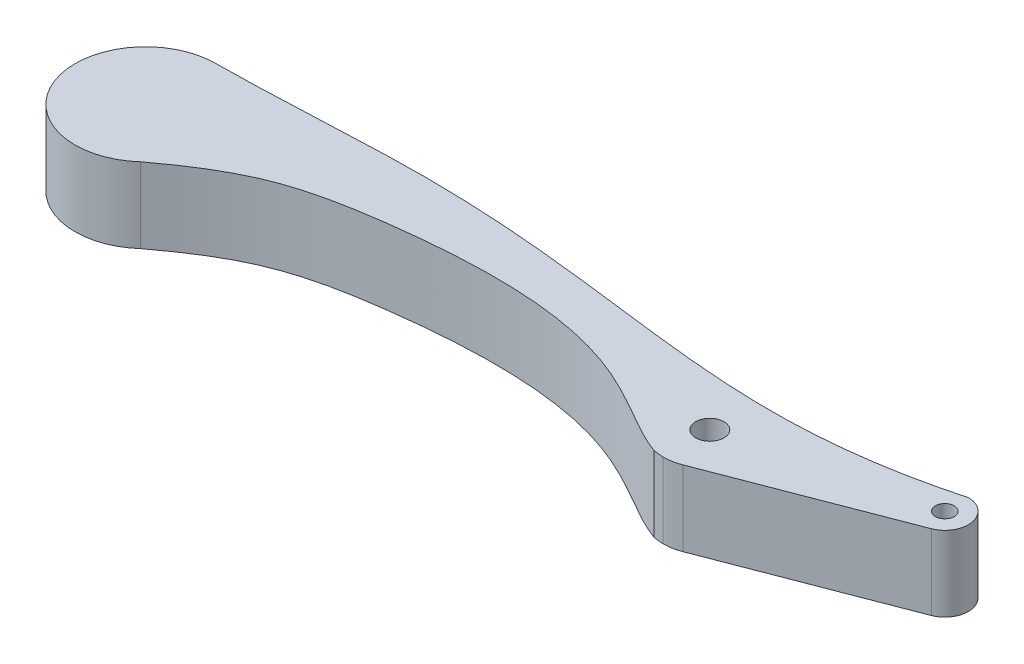
ISO-10303-21;
HEADER;
FILE_DESCRIPTION(('STEP AP214'),'2;1');
FILE_NAME('part.step','',(''),(''),'','','');
FILE_SCHEMA(('AUTOMOTIVE_DESIGN { 1 0 10303 214 1 1 1 1 }'));
ENDSEC;
DATA;
#1=APPLICATION_CONTEXT('core data for automotive mechanical design processes');
#2=APPLICATION_PROTOCOL_DEFINITION('international standard','automotive_design',2000,#1);
#3=PRODUCT_CONTEXT('',#1,'mechanical');
#4=PRODUCT('Part','Part','',(#3));
#5=PRODUCT_RELATED_PRODUCT_CATEGORY('part','',(#4));
#6=PRODUCT_DEFINITION_FORMATION('','',#4);
#7=PRODUCT_DEFINITION_CONTEXT('part definition',#1,'design');
#8=PRODUCT_DEFINITION('design','',#6,#7);
#9=PRODUCT_DEFINITION_SHAPE('','',#8);
#10=(LENGTH_UNIT() NAMED_UNIT(*) SI_UNIT(.MILLI.,.METRE.));
#11=(NAMED_UNIT(*) PLANE_ANGLE_UNIT() SI_UNIT($,.RADIAN.));
#12=(NAMED_UNIT(*) SI_UNIT($,.STERADIAN.) SOLID_ANGLE_UNIT());
#13=UNCERTAINTY_MEASURE_WITH_UNIT(LENGTH_MEASURE(1.E-05),#10,'distance_accuracy_value','');
#14=(GEOMETRIC_REPRESENTATION_CONTEXT(3) GLOBAL_UNCERTAINTY_ASSIGNED_CONTEXT((#13)) GLOBAL_UNIT_ASSIGNED_CONTEXT((#10,
#11,#12)) REPRESENTATION_CONTEXT('',''));
#15=CARTESIAN_POINT('',(0.,0.,0.));
#16=DIRECTION('',(0.,0.,1.));
#17=DIRECTION('',(1.,0.,0.));
#18=AXIS2_PLACEMENT_3D('',#15,#16,#17);
#19=CARTESIAN_POINT('',(0.,8.,-7.5));
#20=CARTESIAN_POINT('',(6.59618739379903,8.,-7.53042618499185));
#21=CARTESIAN_POINT('',(41.0181532042921,8.,-10.2662820268828));
#22=CARTESIAN_POINT('',(57.4957136227641,8.,-1.43169155879023));
#23=CARTESIAN_POINT('',(79.9999926350941,8.,-7.52972858327825));
#24=B_SPLINE_CURVE_WITH_KNOTS('',3,(#19,#20,#21,#22,#23),.UNSPECIFIED.,.F.,.F.,(4,1,4),(0.,
0.213970645101802,1.),.UNSPECIFIED.);
#25=DIRECTION('',(0.,-1.,0.));
#26=VECTOR('',#25,1.);
#27=SURFACE_OF_LINEAR_EXTRUSION('',#24,#26);
#28=CARTESIAN_POINT('',(0.,0.,-7.5));
#29=CARTESIAN_POINT('',(6.59618739379903,0.,-7.53042618499185));
#30=CARTESIAN_POINT('',(41.0181532042921,0.,-10.2662820268828));
#31=CARTESIAN_POINT('',(57.4957136227641,0.,-1.43169155879023));
#32=CARTESIAN_POINT('',(79.9999926350941,0.,-7.52972858327825));
#33=B_SPLINE_CURVE_WITH_KNOTS('',3,(#28,#29,#30,#31,#32),.UNSPECIFIED.,.F.,.F.,(4,1,4),(0.,
0.213970645101802,1.),.UNSPECIFIED.);
#34=CARTESIAN_POINT('',(0.,0.,-7.49999999999999));
#35=VERTEX_POINT('',#34);
#36=CARTESIAN_POINT('',(79.999992635094,0.,-7.52972858327824));
#37=VERTEX_POINT('',#36);
#38=EDGE_CURVE('E145',#35,#37,#33,.T.);
#39=ORIENTED_EDGE('',*,*,#38,.F.);
#40=DIRECTION('',(0.,-1.,0.));
#41=VECTOR('',#40,1.);
#42=CARTESIAN_POINT('',(0.,8.,-7.49999999999999));
#43=LINE('',#42,#41);
#44=CARTESIAN_POINT('',(0.,8.,-7.49999999999999));
#45=VERTEX_POINT('',#44);
#46=EDGE_CURVE('E11',#45,#35,#43,.T.);
#47=ORIENTED_EDGE('',*,*,#46,.F.);
#48=CARTESIAN_POINT('',(79.999992635094,8.,-7.52972858327824));
#49=VERTEX_POINT('',#48);
#50=EDGE_CURVE('E186',#45,#49,#24,.T.);
#51=ORIENTED_EDGE('',*,*,#50,.T.);
#52=DIRECTION('',(0.,-1.,0.));
#53=VECTOR('',#52,1.);
#54=CARTESIAN_POINT('',(79.999992635094,8.,-7.52972858327824));
#55=LINE('',#54,#53);
#56=EDGE_CURVE('E94',#49,#37,#55,.T.);
#57=ORIENTED_EDGE('',*,*,#56,.T.);
#58=EDGE_LOOP('',(#39,#47,#51,#57));
#59=FACE_BOUND('',#58,.T.);
#60=ADVANCED_FACE('F45',(#59),#27,.T.);
#61=CARTESIAN_POINT('',(5.03731244492082,8.,5.55657118484465));
#62=CARTESIAN_POINT('',(8.0215715054593,8.,3.32285112044769));
#63=CARTESIAN_POINT('',(13.6358152084039,8.,-0.236701705320971));
#64=CARTESIAN_POINT('',(47.1128364124341,8.,-6.0862178555139));
#65=CARTESIAN_POINT('',(52.1283803955074,8.,2.37645542334605));
#66=CARTESIAN_POINT('',(58.9707228196847,8.,4.86318503205236));
#67=B_SPLINE_CURVE_WITH_KNOTS('',3,(#61,#62,#63,#64,#65,#66),.UNSPECIFIED.,.F.,.F.,(4,1,1,4),
(0.0206670520231245,0.119805518021766,0.217738812819453,1.),.UNSPECIFIED.);
#68=DIRECTION('',(0.,-1.,0.));
#69=VECTOR('',#68,1.);
#70=SURFACE_OF_LINEAR_EXTRUSION('',#67,#69);
#71=CARTESIAN_POINT('',(5.03731244492082,0.,5.55657118484465));
#72=CARTESIAN_POINT('',(8.0215715054593,0.,3.32285112044769));
#73=CARTESIAN_POINT('',(13.6358152084039,0.,-0.236701705320971));
#74=CARTESIAN_POINT('',(47.1128364124341,0.,-6.0862178555139));
#75=CARTESIAN_POINT('',(52.1283803955074,0.,2.37645542334605));
#76=CARTESIAN_POINT('',(58.9707228196847,0.,4.86318503205236));
#77=B_SPLINE_CURVE_WITH_KNOTS('',3,(#71,#72,#73,#74,#75,#76),.UNSPECIFIED.,.F.,.F.,(4,1,1,4),
(0.0206670520231245,0.119805518021766,0.217738812819453,1.),.UNSPECIFIED.);
#78=CARTESIAN_POINT('',(5.03731244492081,0.,5.55657118484464));
#79=VERTEX_POINT('',#78);
#80=CARTESIAN_POINT('',(58.9707228196847,0.,4.86318503205234));
#81=VERTEX_POINT('',#80);
#82=EDGE_CURVE('E151',#79,#81,#77,.T.);
#83=ORIENTED_EDGE('',*,*,#82,.T.);
#84=DIRECTION('',(0.,-1.,0.));
#85=VECTOR('',#84,1.);
#86=CARTESIAN_POINT('',(58.9707228196847,8.,4.86318503205234));
#87=LINE('',#86,#85);
#88=CARTESIAN_POINT('',(58.9707228196847,8.,4.86318503205234));
#89=VERTEX_POINT('',#88);
#90=EDGE_CURVE('E193',#89,#81,#87,.T.);
#91=ORIENTED_EDGE('',*,*,#90,.F.);
#92=CARTESIAN_POINT('',(5.03731244492081,8.,5.55657118484464));
#93=VERTEX_POINT('',#92);
#94=EDGE_CURVE('E102',#93,#89,#67,.T.);
#95=ORIENTED_EDGE('',*,*,#94,.F.);
#96=DIRECTION('',(0.,-1.,0.));
#97=VECTOR('',#96,1.);
#98=CARTESIAN_POINT('',(5.03731244492081,8.,5.55657118484464));
#99=LINE('',#98,#97);
#100=EDGE_CURVE('E55',#93,#79,#99,.T.);
#101=ORIENTED_EDGE('',*,*,#100,.T.);
#102=EDGE_LOOP('',(#83,#91,#95,#101));
#103=FACE_BOUND('',#102,.T.);
#104=ADVANCED_FACE('F201',(#103),#70,.F.);
#105=CARTESIAN_POINT('',(58.9707228196847,8.,4.86318503205232));
#106=CARTESIAN_POINT('',(58.9781403232572,8.,4.86320370724343));
#107=CARTESIAN_POINT('',(59.992575824296,8.,4.97025708409772));
#108=CARTESIAN_POINT('',(59.999992635094,8.,4.97027141672176));
#109=B_SPLINE_CURVE_WITH_KNOTS('',3,(#105,#106,#107,#108),.UNSPECIFIED.,.F.,.F.,(4,4),
(0.714198539813145,0.714487623139183),.UNSPECIFIED.);
#110=DIRECTION('',(0.,-1.,0.));
#111=VECTOR('',#110,1.);
#112=SURFACE_OF_LINEAR_EXTRUSION('',#109,#111);
#113=CARTESIAN_POINT('',(58.9707228196847,0.,4.86318503205232));
#114=CARTESIAN_POINT('',(58.9781403232572,0.,4.86320370724343));
#115=CARTESIAN_POINT('',(59.992575824296,0.,4.97025708409772));
#116=CARTESIAN_POINT('',(59.999992635094,0.,4.97027141672176));
#117=B_SPLINE_CURVE_WITH_KNOTS('',3,(#113,#114,#115,#116),.UNSPECIFIED.,.F.,.F.,(4,4),
(0.714198539813145,0.714487623139183),.UNSPECIFIED.);
#118=CARTESIAN_POINT('',(59.999992635094,0.,4.97027141672176));
#119=VERTEX_POINT('',#118);
#120=EDGE_CURVE('E160',#81,#119,#117,.T.);
#121=ORIENTED_EDGE('',*,*,#120,.T.);
#122=DIRECTION('',(0.,-1.,0.));
#123=VECTOR('',#122,1.);
#124=CARTESIAN_POINT('',(59.999992635094,8.,4.97027141672176));
#125=LINE('',#124,#123);
#126=CARTESIAN_POINT('',(59.999992635094,8.,4.97027141672176));
#127=VERTEX_POINT('',#126);
#128=EDGE_CURVE('E127',#127,#119,#125,.T.);
#129=ORIENTED_EDGE('',*,*,#128,.F.);
#130=EDGE_CURVE('E116',#89,#127,#109,.T.);
#131=ORIENTED_EDGE('',*,*,#130,.F.);
#132=ORIENTED_EDGE('',*,*,#90,.T.);
#133=EDGE_LOOP('',(#121,#129,#131,#132));
#134=FACE_BOUND('',#133,.T.);
#135=ADVANCED_FACE('F213',(#134),#112,.F.);
#136=CARTESIAN_POINT('',(59.999992635094,8.,-0.0297285832782379));
#137=DIRECTION('',(0.,-1.,0.));
#138=DIRECTION('',(0.,0.,-1.));
#139=AXIS2_PLACEMENT_3D('',#136,#137,#138);
#140=CYLINDRICAL_SURFACE('',#139,5.);
#141=CARTESIAN_POINT('',(59.999992635094,0.,-0.0297285832782379));
#142=DIRECTION('',(0.,1.,0.));
#143=DIRECTION('',(0.,0.,1.));
#144=AXIS2_PLACEMENT_3D('',#141,#142,#143);
#145=CIRCLE('',#144,5.);
#146=CARTESIAN_POINT('',(61.7919562780164,0.,4.63812598841144));
#147=VERTEX_POINT('',#146);
#148=EDGE_CURVE('E125',#119,#147,#145,.T.);
#149=ORIENTED_EDGE('',*,*,#148,.T.);
#150=DIRECTION('',(0.,-1.,0.));
#151=VECTOR('',#150,1.);
#152=CARTESIAN_POINT('',(61.7919562780164,8.,4.63812598841144));
#153=LINE('',#152,#151);
#154=CARTESIAN_POINT('',(61.7919562780164,8.,4.63812598841144));
#155=VERTEX_POINT('',#154);
#156=EDGE_CURVE('E122',#155,#147,#153,.T.);
#157=ORIENTED_EDGE('',*,*,#156,.F.);
#158=CARTESIAN_POINT('',(59.999992635094,8.,-0.0297285832782379));
#159=DIRECTION('',(0.,1.,0.));
#160=DIRECTION('',(0.,0.,1.));
#161=AXIS2_PLACEMENT_3D('',#158,#159,#160);
#162=CIRCLE('',#161,5.);
#163=EDGE_CURVE('E109',#127,#155,#162,.T.);
#164=ORIENTED_EDGE('',*,*,#163,.F.);
#165=ORIENTED_EDGE('',*,*,#128,.T.);
#166=EDGE_LOOP('',(#149,#157,#164,#165));
#167=FACE_BOUND('',#166,.T.);
#168=ADVANCED_FACE('F123',(#167),#140,.T.);
#169=CARTESIAN_POINT('',(9.48873683222016,8.,24.717043661447));
#170=DIRECTION('',(-0.358392728584484,0.,-0.933570914337935));
#171=DIRECTION('',(-0.933570914337935,0.,0.358392728584484));
#172=AXIS2_PLACEMENT_3D('',#169,#170,#171);
#173=PLANE('',#172);
#174=DIRECTION('',(0.933570914337935,0.,-0.358392728584484));
#175=VECTOR('',#174,1.);
#176=CARTESIAN_POINT('',(9.48873683222016,0.,24.717043661447));
#177=LINE('',#176,#175);
#178=CARTESIAN_POINT('',(80.8959744565552,0.,-2.6958012974334));
#179=VERTEX_POINT('',#178);
#180=EDGE_CURVE('E87',#147,#179,#177,.T.);
#181=ORIENTED_EDGE('',*,*,#180,.T.);
#182=DIRECTION('',(0.,-1.,0.));
#183=VECTOR('',#182,1.);
#184=CARTESIAN_POINT('',(80.8959744565552,8.,-2.6958012974334));
#185=LINE('',#184,#183);
#186=CARTESIAN_POINT('',(80.8959744565552,8.,-2.6958012974334));
#187=VERTEX_POINT('',#186);
#188=EDGE_CURVE('E128',#187,#179,#185,.T.);
#189=ORIENTED_EDGE('',*,*,#188,.F.);
#190=DIRECTION('',(0.933570914337935,0.,-0.358392728584484));
#191=VECTOR('',#190,1.);
#192=CARTESIAN_POINT('',(9.48873683222016,8.,24.717043661447));
#193=LINE('',#192,#191);
#194=EDGE_CURVE('E114',#155,#187,#193,.T.);
#195=ORIENTED_EDGE('',*,*,#194,.F.);
#196=ORIENTED_EDGE('',*,*,#156,.T.);
#197=EDGE_LOOP('',(#181,#189,#195,#196));
#198=FACE_BOUND('',#197,.T.);
#199=ADVANCED_FACE('F130',(#198),#173,.F.);
#200=CARTESIAN_POINT('',(59.999992635094,8.,-0.0297285832782379));
#201=DIRECTION('',(0.,-1.,0.));
#202=DIRECTION('',(0.,0.,-1.));
#203=AXIS2_PLACEMENT_3D('',#200,#201,#202);
#204=CYLINDRICAL_SURFACE('',#203,1.5);
#205=CARTESIAN_POINT('',(59.999992635094,8.,-0.0297285832782379));
#206=DIRECTION('',(0.,1.,0.));
#207=DIRECTION('',(0.,0.,1.));
#208=AXIS2_PLACEMENT_3D('',#205,#206,#207);
#209=CIRCLE('',#208,1.5);
#210=CARTESIAN_POINT('',(59.999992635094,8.,1.47027141672176));
#211=VERTEX_POINT('',#210);
#212=EDGE_CURVE('E134',#211,#211,#209,.T.);
#213=ORIENTED_EDGE('',*,*,#212,.T.);
#214=EDGE_LOOP('',(#213));
#215=FACE_BOUND('',#214,.T.);
#216=CARTESIAN_POINT('',(59.999992635094,0.,-0.0297285832782379));
#217=DIRECTION('',(0.,1.,0.));
#218=DIRECTION('',(0.,0.,1.));
#219=AXIS2_PLACEMENT_3D('',#216,#217,#218);
#220=CIRCLE('',#219,1.5);
#221=CARTESIAN_POINT('',(59.999992635094,0.,1.47027141672176));
#222=VERTEX_POINT('',#221);
#223=EDGE_CURVE('E178',#222,#222,#220,.T.);
#224=ORIENTED_EDGE('',*,*,#223,.F.);
#225=EDGE_LOOP('',(#224));
#226=FACE_BOUND('',#225,.T.);
#227=ADVANCED_FACE('F266',(#215,#226),#204,.F.);
#228=CARTESIAN_POINT('',(79.999992635094,8.,-5.02972858327824));
#229=DIRECTION('',(0.,-1.,0.));
#230=DIRECTION('',(0.,0.,-1.));
#231=AXIS2_PLACEMENT_3D('',#228,#229,#230);
#232=CYLINDRICAL_SURFACE('',#231,2.50000000000001);
#233=CARTESIAN_POINT('',(79.999992635094,0.,-5.02972858327824));
#234=DIRECTION('',(0.,1.,0.));
#235=DIRECTION('',(0.,0.,1.));
#236=AXIS2_PLACEMENT_3D('',#233,#234,#235);
#237=CIRCLE('',#236,2.50000000000001);
#238=EDGE_CURVE('E175',#179,#37,#237,.T.);
#239=ORIENTED_EDGE('',*,*,#238,.T.);
#240=ORIENTED_EDGE('',*,*,#56,.F.);
#241=CARTESIAN_POINT('',(79.999992635094,8.,-5.02972858327824));
#242=DIRECTION('',(0.,1.,0.));
#243=DIRECTION('',(0.,0.,1.));
#244=AXIS2_PLACEMENT_3D('',#241,#242,#243);
#245=CIRCLE('',#244,2.50000000000001);
#246=EDGE_CURVE('E63',#187,#49,#245,.T.);
#247=ORIENTED_EDGE('',*,*,#246,.F.);
#248=ORIENTED_EDGE('',*,*,#188,.T.);
#249=EDGE_LOOP('',(#239,#240,#247,#248));
#250=FACE_BOUND('',#249,.T.);
#251=ADVANCED_FACE('F239',(#250),#232,.T.);
#252=CARTESIAN_POINT('',(79.999992635094,8.,-5.02972858327824));
#253=DIRECTION('',(0.,-1.,0.));
#254=DIRECTION('',(0.,0.,-1.));
#255=AXIS2_PLACEMENT_3D('',#252,#253,#254);
#256=CYLINDRICAL_SURFACE('',#255,0.999999999999998);
#257=CARTESIAN_POINT('',(79.999992635094,8.,-5.02972858327824));
#258=DIRECTION('',(0.,1.,0.));
#259=DIRECTION('',(0.,0.,1.));
#260=AXIS2_PLACEMENT_3D('',#257,#258,#259);
#261=CIRCLE('',#260,0.999999999999998);
#262=CARTESIAN_POINT('',(79.999992635094,8.,-4.02972858327824));
#263=VERTEX_POINT('',#262);
#264=EDGE_CURVE('E141',#263,#263,#261,.T.);
#265=ORIENTED_EDGE('',*,*,#264,.T.);
#266=EDGE_LOOP('',(#265));
#267=FACE_BOUND('',#266,.T.);
#268=CARTESIAN_POINT('',(79.999992635094,0.,-5.02972858327824));
#269=DIRECTION('',(0.,1.,0.));
#270=DIRECTION('',(0.,0.,1.));
#271=AXIS2_PLACEMENT_3D('',#268,#269,#270);
#272=CIRCLE('',#271,0.999999999999998);
#273=CARTESIAN_POINT('',(79.999992635094,0.,-4.02972858327824));
#274=VERTEX_POINT('',#273);
#275=EDGE_CURVE('E182',#274,#274,#272,.T.);
#276=ORIENTED_EDGE('',*,*,#275,.F.);
#277=EDGE_LOOP('',(#276));
#278=FACE_BOUND('',#277,.T.);
#279=ADVANCED_FACE('F261',(#267,#278),#256,.F.);
#280=CARTESIAN_POINT('',(0.,8.,0.));
#281=DIRECTION('',(0.,1.,0.));
#282=DIRECTION('',(0.,0.,1.));
#283=AXIS2_PLACEMENT_3D('',#280,#281,#282);
#284=PLANE('',#283);
#285=ORIENTED_EDGE('',*,*,#50,.F.);
#286=CARTESIAN_POINT('',(0.,8.,0.));
#287=DIRECTION('',(0.,1.,0.));
#288=DIRECTION('',(0.,0.,1.));
#289=AXIS2_PLACEMENT_3D('',#286,#287,#288);
#290=CIRCLE('',#289,7.49999999999999);
#291=EDGE_CURVE('E152',#45,#93,#290,.T.);
#292=ORIENTED_EDGE('',*,*,#291,.T.);
#293=ORIENTED_EDGE('',*,*,#94,.T.);
#294=ORIENTED_EDGE('',*,*,#130,.T.);
#295=ORIENTED_EDGE('',*,*,#163,.T.);
#296=ORIENTED_EDGE('',*,*,#194,.T.);
#297=ORIENTED_EDGE('',*,*,#246,.T.);
#298=EDGE_LOOP('',(#285,#292,#293,#294,#295,#296,#297));
#299=FACE_BOUND('',#298,.T.);
#300=ORIENTED_EDGE('',*,*,#212,.F.);
#301=EDGE_LOOP('',(#300));
#302=FACE_BOUND('',#301,.T.);
#303=ORIENTED_EDGE('',*,*,#264,.F.);
#304=EDGE_LOOP('',(#303));
#305=FACE_BOUND('',#304,.T.);
#306=ADVANCED_FACE('F111',(#299,#302,#305),#284,.T.);
#307=CARTESIAN_POINT('',(0.,0.,0.));
#308=DIRECTION('',(0.,1.,0.));
#309=DIRECTION('',(0.,0.,1.));
#310=AXIS2_PLACEMENT_3D('',#307,#308,#309);
#311=PLANE('',#310);
#312=ORIENTED_EDGE('',*,*,#38,.T.);
#313=ORIENTED_EDGE('',*,*,#238,.F.);
#314=ORIENTED_EDGE('',*,*,#180,.F.);
#315=ORIENTED_EDGE('',*,*,#148,.F.);
#316=ORIENTED_EDGE('',*,*,#120,.F.);
#317=ORIENTED_EDGE('',*,*,#82,.F.);
#318=CARTESIAN_POINT('',(0.,0.,0.));
#319=DIRECTION('',(0.,1.,0.));
#320=DIRECTION('',(0.,0.,1.));
#321=AXIS2_PLACEMENT_3D('',#318,#319,#320);
#322=CIRCLE('',#321,7.49999999999999);
#323=EDGE_CURVE('E211',#35,#79,#322,.T.);
#324=ORIENTED_EDGE('',*,*,#323,.F.);
#325=EDGE_LOOP('',(#312,#313,#314,#315,#316,#317,#324));
#326=FACE_BOUND('',#325,.T.);
#327=ORIENTED_EDGE('',*,*,#223,.T.);
#328=EDGE_LOOP('',(#327));
#329=FACE_BOUND('',#328,.T.);
#330=ORIENTED_EDGE('',*,*,#275,.T.);
#331=EDGE_LOOP('',(#330));
#332=FACE_BOUND('',#331,.T.);
#333=ADVANCED_FACE('F209',(#326,#329,#332),#311,.F.);
#334=CARTESIAN_POINT('',(0.,8.,0.));
#335=DIRECTION('',(0.,-1.,0.));
#336=DIRECTION('',(0.,0.,-1.));
#337=AXIS2_PLACEMENT_3D('',#334,#335,#336);
#338=CYLINDRICAL_SURFACE('',#337,7.49999999999999);
#339=ORIENTED_EDGE('',*,*,#46,.T.);
#340=ORIENTED_EDGE('',*,*,#323,.T.);
#341=ORIENTED_EDGE('',*,*,#100,.F.);
#342=ORIENTED_EDGE('',*,*,#291,.F.);
#343=EDGE_LOOP('',(#339,#340,#341,#342));
#344=FACE_BOUND('',#343,.T.);
#345=ADVANCED_FACE('F252',(#344),#338,.T.);
#346=CLOSED_SHELL('',(#60,#104,#135,#168,#199,#227,#251,#279,#306,#333,#345));
#347=MANIFOLD_SOLID_BREP('B2',#346);
#348=ADVANCED_BREP_SHAPE_REPRESENTATION('',(#18,#347),#14);
#349=SHAPE_DEFINITION_REPRESENTATION(#9,#348);
ENDSEC;
END-ISO-10303-21;
